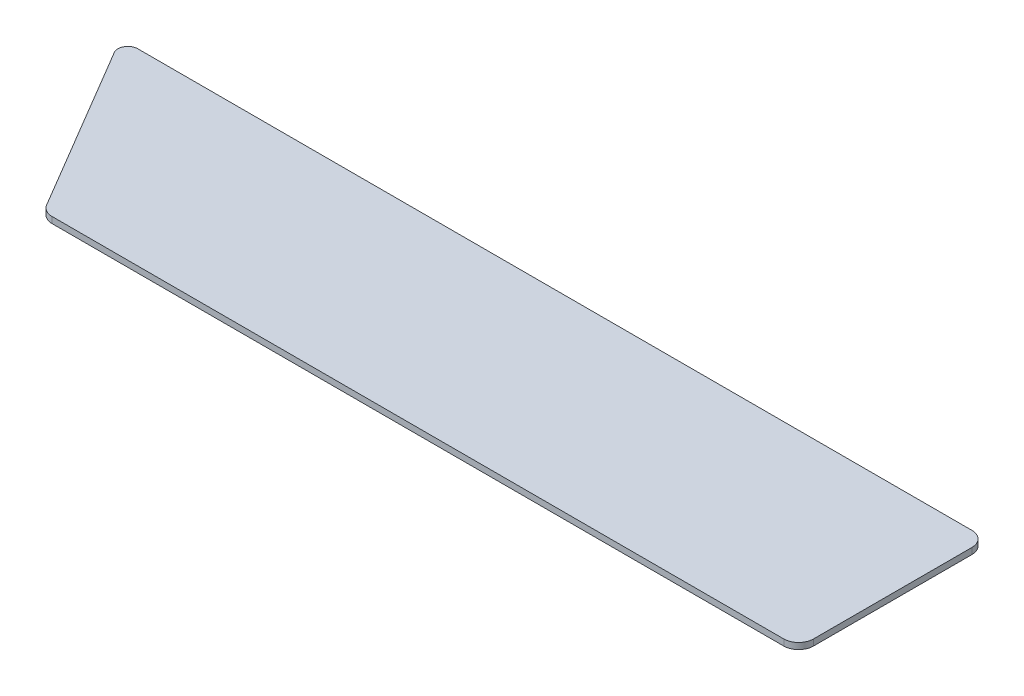
ISO-10303-21;
HEADER;
FILE_DESCRIPTION(('STEP AP214'),'2;1');
FILE_NAME('part.step','',(''),(''),'','','');
FILE_SCHEMA(('AUTOMOTIVE_DESIGN { 1 0 10303 214 1 1 1 1 }'));
ENDSEC;
DATA;
#1=APPLICATION_CONTEXT('core data for automotive mechanical design processes');
#2=APPLICATION_PROTOCOL_DEFINITION('international standard','automotive_design',2000,#1);
#3=PRODUCT_CONTEXT('',#1,'mechanical');
#4=PRODUCT('Part','Part','',(#3));
#5=PRODUCT_RELATED_PRODUCT_CATEGORY('part','',(#4));
#6=PRODUCT_DEFINITION_FORMATION('','',#4);
#7=PRODUCT_DEFINITION_CONTEXT('part definition',#1,'design');
#8=PRODUCT_DEFINITION('design','',#6,#7);
#9=PRODUCT_DEFINITION_SHAPE('','',#8);
#10=(LENGTH_UNIT() NAMED_UNIT(*) SI_UNIT(.MILLI.,.METRE.));
#11=(NAMED_UNIT(*) PLANE_ANGLE_UNIT() SI_UNIT($,.RADIAN.));
#12=(NAMED_UNIT(*) SI_UNIT($,.STERADIAN.) SOLID_ANGLE_UNIT());
#13=UNCERTAINTY_MEASURE_WITH_UNIT(LENGTH_MEASURE(1.E-05),#10,'distance_accuracy_value','');
#14=(GEOMETRIC_REPRESENTATION_CONTEXT(3) GLOBAL_UNCERTAINTY_ASSIGNED_CONTEXT((#13)) GLOBAL_UNIT_ASSIGNED_CONTEXT((#10,
#11,#12)) REPRESENTATION_CONTEXT('',''));
#15=CARTESIAN_POINT('',(0.,0.,0.));
#16=DIRECTION('',(0.,0.,1.));
#17=DIRECTION('',(1.,0.,0.));
#18=AXIS2_PLACEMENT_3D('',#15,#16,#17);
#19=CARTESIAN_POINT('',(0.,3.175,0.));
#20=DIRECTION('',(0.,0.,-1.));
#21=DIRECTION('',(-1.,0.,0.));
#22=AXIS2_PLACEMENT_3D('',#19,#20,#21);
#23=PLANE('',#22);
#24=DIRECTION('',(1.,0.,0.));
#25=VECTOR('',#24,1.);
#26=CARTESIAN_POINT('',(0.,0.,0.));
#27=LINE('',#26,#25);
#28=CARTESIAN_POINT('',(61.4937278471919,0.,0.));
#29=VERTEX_POINT('',#28);
#30=CARTESIAN_POINT('',(436.88,0.,0.));
#31=VERTEX_POINT('',#30);
#32=EDGE_CURVE('E194',#29,#31,#27,.T.);
#33=ORIENTED_EDGE('',*,*,#32,.T.);
#34=DIRECTION('',(0.,-1.,0.));
#35=VECTOR('',#34,1.);
#36=CARTESIAN_POINT('',(436.88,3.175,0.));
#37=LINE('',#36,#35);
#38=CARTESIAN_POINT('',(436.88,3.175,0.));
#39=VERTEX_POINT('',#38);
#40=EDGE_CURVE('E158',#31,#39,#37,.F.);
#41=ORIENTED_EDGE('',*,*,#40,.T.);
#42=DIRECTION('',(1.,0.,0.));
#43=VECTOR('',#42,1.);
#44=CARTESIAN_POINT('',(0.,3.175,0.));
#45=LINE('',#44,#43);
#46=CARTESIAN_POINT('',(61.4937278471919,3.175,0.));
#47=VERTEX_POINT('',#46);
#48=EDGE_CURVE('E180',#47,#39,#45,.T.);
#49=ORIENTED_EDGE('',*,*,#48,.F.);
#50=DIRECTION('',(0.,-1.,0.));
#51=VECTOR('',#50,1.);
#52=CARTESIAN_POINT('',(61.4937278471919,3.175,0.));
#53=LINE('',#52,#51);
#54=EDGE_CURVE('E154',#47,#29,#53,.T.);
#55=ORIENTED_EDGE('',*,*,#54,.T.);
#56=EDGE_LOOP('',(#33,#41,#49,#55));
#57=FACE_BOUND('',#56,.T.);
#58=ADVANCED_FACE('F41',(#57),#23,.F.);
#59=CARTESIAN_POINT('',(444.5,3.175,0.));
#60=DIRECTION('',(-1.,0.,0.));
#61=DIRECTION('',(0.,0.,1.));
#62=AXIS2_PLACEMENT_3D('',#59,#60,#61);
#63=PLANE('',#62);
#64=DIRECTION('',(0.,0.,-1.));
#65=VECTOR('',#64,1.);
#66=CARTESIAN_POINT('',(444.5,0.,0.));
#67=LINE('',#66,#65);
#68=CARTESIAN_POINT('',(444.5,0.,-7.62));
#69=VERTEX_POINT('',#68);
#70=CARTESIAN_POINT('',(444.5,0.,-88.9));
#71=VERTEX_POINT('',#70);
#72=EDGE_CURVE('E111',#69,#71,#67,.T.);
#73=ORIENTED_EDGE('',*,*,#72,.T.);
#74=DIRECTION('',(0.,-1.,0.));
#75=VECTOR('',#74,1.);
#76=CARTESIAN_POINT('',(444.5,3.175,-88.9));
#77=LINE('',#76,#75);
#78=CARTESIAN_POINT('',(444.5,3.175,-88.9));
#79=VERTEX_POINT('',#78);
#80=EDGE_CURVE('E119',#71,#79,#77,.F.);
#81=ORIENTED_EDGE('',*,*,#80,.T.);
#82=DIRECTION('',(0.,0.,-1.));
#83=VECTOR('',#82,1.);
#84=CARTESIAN_POINT('',(444.5,3.175,0.));
#85=LINE('',#84,#83);
#86=CARTESIAN_POINT('',(444.5,3.175,-7.62));
#87=VERTEX_POINT('',#86);
#88=EDGE_CURVE('E183',#87,#79,#85,.T.);
#89=ORIENTED_EDGE('',*,*,#88,.F.);
#90=DIRECTION('',(0.,-1.,0.));
#91=VECTOR('',#90,1.);
#92=CARTESIAN_POINT('',(444.5,3.175,-7.62));
#93=LINE('',#92,#91);
#94=EDGE_CURVE('E121',#87,#69,#93,.T.);
#95=ORIENTED_EDGE('',*,*,#94,.T.);
#96=EDGE_LOOP('',(#73,#81,#89,#95));
#97=FACE_BOUND('',#96,.T.);
#98=ADVANCED_FACE('F200',(#97),#63,.F.);
#99=CARTESIAN_POINT('',(0.,3.175,-96.52));
#100=DIRECTION('',(0.,0.,-1.));
#101=DIRECTION('',(-1.,0.,0.));
#102=AXIS2_PLACEMENT_3D('',#99,#100,#101);
#103=PLANE('',#102);
#104=DIRECTION('',(1.,0.,0.));
#105=VECTOR('',#104,1.);
#106=CARTESIAN_POINT('',(0.,0.,-96.52));
#107=LINE('',#106,#105);
#108=CARTESIAN_POINT('',(8.91160803847884,0.,-96.52));
#109=VERTEX_POINT('',#108);
#110=CARTESIAN_POINT('',(436.88,0.,-96.52));
#111=VERTEX_POINT('',#110);
#112=EDGE_CURVE('E102',#109,#111,#107,.T.);
#113=ORIENTED_EDGE('',*,*,#112,.F.);
#114=DIRECTION('',(0.,-1.,0.));
#115=VECTOR('',#114,1.);
#116=CARTESIAN_POINT('',(8.91160803847884,3.175,-96.52));
#117=LINE('',#116,#115);
#118=CARTESIAN_POINT('',(8.91160803847884,3.175,-96.52));
#119=VERTEX_POINT('',#118);
#120=EDGE_CURVE('E50',#109,#119,#117,.F.);
#121=ORIENTED_EDGE('',*,*,#120,.T.);
#122=DIRECTION('',(1.,0.,0.));
#123=VECTOR('',#122,1.);
#124=CARTESIAN_POINT('',(0.,3.175,-96.52));
#125=LINE('',#124,#123);
#126=CARTESIAN_POINT('',(436.88,3.175,-96.52));
#127=VERTEX_POINT('',#126);
#128=EDGE_CURVE('E125',#119,#127,#125,.T.);
#129=ORIENTED_EDGE('',*,*,#128,.T.);
#130=DIRECTION('',(0.,-1.,0.));
#131=VECTOR('',#130,1.);
#132=CARTESIAN_POINT('',(436.88,0.,-96.52));
#133=LINE('',#132,#131);
#134=EDGE_CURVE('E118',#127,#111,#133,.T.);
#135=ORIENTED_EDGE('',*,*,#134,.T.);
#136=EDGE_LOOP('',(#113,#121,#129,#135));
#137=FACE_BOUND('',#136,.T.);
#138=ADVANCED_FACE('F124',(#137),#103,.T.);
#139=CARTESIAN_POINT('',(42.3148827073452,3.175,-25.0548647609281));
#140=DIRECTION('',(0.860475389038901,0.,-0.509492006667771));
#141=DIRECTION('',(-0.509492006667771,0.,-0.860475389038901));
#142=AXIS2_PLACEMENT_3D('',#139,#140,#141);
#143=PLANE('',#142);
#144=DIRECTION('',(0.509492006667771,0.,0.860475389038901));
#145=VECTOR('',#144,1.);
#146=CARTESIAN_POINT('',(42.3148827073452,3.175,-25.0548647609281));
#147=LINE('',#146,#145);
#148=CARTESIAN_POINT('',(4.54039306216122,3.175,-88.8517806061277));
#149=VERTEX_POINT('',#148);
#150=CARTESIAN_POINT('',(54.9369053827155,3.175,-3.73767090919159));
#151=VERTEX_POINT('',#150);
#152=EDGE_CURVE('E129',#149,#151,#147,.T.);
#153=ORIENTED_EDGE('',*,*,#152,.F.);
#154=DIRECTION('',(0.,-1.,0.));
#155=VECTOR('',#154,1.);
#156=CARTESIAN_POINT('',(4.54039306216122,0.,-88.8517806061277));
#157=LINE('',#156,#155);
#158=CARTESIAN_POINT('',(4.54039306216122,0.,-88.8517806061277));
#159=VERTEX_POINT('',#158);
#160=EDGE_CURVE('E165',#149,#159,#157,.T.);
#161=ORIENTED_EDGE('',*,*,#160,.T.);
#162=DIRECTION('',(0.509492006667771,0.,0.860475389038901));
#163=VECTOR('',#162,1.);
#164=CARTESIAN_POINT('',(42.3148827073452,0.,-25.0548647609281));
#165=LINE('',#164,#163);
#166=CARTESIAN_POINT('',(54.9369053827155,0.,-3.73767090919159));
#167=VERTEX_POINT('',#166);
#168=EDGE_CURVE('E110',#159,#167,#165,.T.);
#169=ORIENTED_EDGE('',*,*,#168,.T.);
#170=DIRECTION('',(0.,-1.,0.));
#171=VECTOR('',#170,1.);
#172=CARTESIAN_POINT('',(54.9369053827155,3.175,-3.73767090919159));
#173=LINE('',#172,#171);
#174=EDGE_CURVE('E161',#167,#151,#173,.F.);
#175=ORIENTED_EDGE('',*,*,#174,.T.);
#176=EDGE_LOOP('',(#153,#161,#169,#175));
#177=FACE_BOUND('',#176,.T.);
#178=ADVANCED_FACE('F174',(#177),#143,.F.);
#179=CARTESIAN_POINT('',(0.,3.175,0.));
#180=DIRECTION('',(0.,1.,0.));
#181=DIRECTION('',(0.,0.,1.));
#182=AXIS2_PLACEMENT_3D('',#179,#180,#181);
#183=PLANE('',#182);
#184=ORIENTED_EDGE('',*,*,#128,.F.);
#185=CARTESIAN_POINT('',(8.91160803847884,3.175,-91.44));
#186=DIRECTION('',(0.,1.,0.));
#187=DIRECTION('',(0.,0.,1.));
#188=AXIS2_PLACEMENT_3D('',#185,#186,#187);
#189=CIRCLE('',#188,5.08);
#190=EDGE_CURVE('E11',#119,#149,#189,.T.);
#191=ORIENTED_EDGE('',*,*,#190,.T.);
#192=ORIENTED_EDGE('',*,*,#152,.T.);
#193=CARTESIAN_POINT('',(61.4937278471919,3.175,-7.62));
#194=DIRECTION('',(0.,1.,0.));
#195=DIRECTION('',(0.,0.,1.));
#196=AXIS2_PLACEMENT_3D('',#193,#194,#195);
#197=CIRCLE('',#196,7.62);
#198=EDGE_CURVE('E145',#151,#47,#197,.T.);
#199=ORIENTED_EDGE('',*,*,#198,.T.);
#200=ORIENTED_EDGE('',*,*,#48,.T.);
#201=CARTESIAN_POINT('',(436.88,3.175,-7.62));
#202=DIRECTION('',(0.,1.,0.));
#203=DIRECTION('',(0.,0.,1.));
#204=AXIS2_PLACEMENT_3D('',#201,#202,#203);
#205=CIRCLE('',#204,7.62);
#206=EDGE_CURVE('E148',#39,#87,#205,.T.);
#207=ORIENTED_EDGE('',*,*,#206,.T.);
#208=ORIENTED_EDGE('',*,*,#88,.T.);
#209=CARTESIAN_POINT('',(436.88,3.175,-88.9));
#210=DIRECTION('',(0.,1.,0.));
#211=DIRECTION('',(0.,0.,1.));
#212=AXIS2_PLACEMENT_3D('',#209,#210,#211);
#213=CIRCLE('',#212,7.62);
#214=EDGE_CURVE('E151',#79,#127,#213,.T.);
#215=ORIENTED_EDGE('',*,*,#214,.T.);
#216=EDGE_LOOP('',(#184,#191,#192,#199,#200,#207,#208,#215));
#217=FACE_BOUND('',#216,.T.);
#218=ADVANCED_FACE('F208',(#217),#183,.T.);
#219=CARTESIAN_POINT('',(0.,0.,0.));
#220=DIRECTION('',(0.,1.,0.));
#221=DIRECTION('',(0.,0.,1.));
#222=AXIS2_PLACEMENT_3D('',#219,#220,#221);
#223=PLANE('',#222);
#224=ORIENTED_EDGE('',*,*,#168,.F.);
#225=CARTESIAN_POINT('',(8.91160803847884,0.,-91.44));
#226=DIRECTION('',(0.,1.,0.));
#227=DIRECTION('',(0.,0.,1.));
#228=AXIS2_PLACEMENT_3D('',#225,#226,#227);
#229=CIRCLE('',#228,5.08);
#230=EDGE_CURVE('E64',#159,#109,#229,.F.);
#231=ORIENTED_EDGE('',*,*,#230,.T.);
#232=ORIENTED_EDGE('',*,*,#112,.T.);
#233=CARTESIAN_POINT('',(436.88,0.,-88.9));
#234=DIRECTION('',(0.,1.,0.));
#235=DIRECTION('',(0.,0.,1.));
#236=AXIS2_PLACEMENT_3D('',#233,#234,#235);
#237=CIRCLE('',#236,7.62);
#238=EDGE_CURVE('E106',#111,#71,#237,.F.);
#239=ORIENTED_EDGE('',*,*,#238,.T.);
#240=ORIENTED_EDGE('',*,*,#72,.F.);
#241=CARTESIAN_POINT('',(436.88,0.,-7.62));
#242=DIRECTION('',(0.,1.,0.));
#243=DIRECTION('',(0.,0.,1.));
#244=AXIS2_PLACEMENT_3D('',#241,#242,#243);
#245=CIRCLE('',#244,7.62);
#246=EDGE_CURVE('E122',#69,#31,#245,.F.);
#247=ORIENTED_EDGE('',*,*,#246,.T.);
#248=ORIENTED_EDGE('',*,*,#32,.F.);
#249=CARTESIAN_POINT('',(61.4937278471919,0.,-7.62));
#250=DIRECTION('',(0.,1.,0.));
#251=DIRECTION('',(0.,0.,1.));
#252=AXIS2_PLACEMENT_3D('',#249,#250,#251);
#253=CIRCLE('',#252,7.62);
#254=EDGE_CURVE('E128',#29,#167,#253,.F.);
#255=ORIENTED_EDGE('',*,*,#254,.T.);
#256=EDGE_LOOP('',(#224,#231,#232,#239,#240,#247,#248,#255));
#257=FACE_BOUND('',#256,.T.);
#258=ADVANCED_FACE('F104',(#257),#223,.F.);
#259=CARTESIAN_POINT('',(436.88,3.175,-88.9));
#260=DIRECTION('',(0.,1.,0.));
#261=DIRECTION('',(0.,0.,1.));
#262=AXIS2_PLACEMENT_3D('',#259,#260,#261);
#263=CYLINDRICAL_SURFACE('',#262,7.62);
#264=ORIENTED_EDGE('',*,*,#214,.F.);
#265=ORIENTED_EDGE('',*,*,#80,.F.);
#266=ORIENTED_EDGE('',*,*,#238,.F.);
#267=ORIENTED_EDGE('',*,*,#134,.F.);
#268=EDGE_LOOP('',(#264,#265,#266,#267));
#269=FACE_BOUND('',#268,.T.);
#270=ADVANCED_FACE('F117',(#269),#263,.T.);
#271=CARTESIAN_POINT('',(436.88,3.175,-7.62));
#272=DIRECTION('',(0.,-1.,0.));
#273=DIRECTION('',(0.,0.,-1.));
#274=AXIS2_PLACEMENT_3D('',#271,#272,#273);
#275=CYLINDRICAL_SURFACE('',#274,7.62);
#276=ORIENTED_EDGE('',*,*,#206,.F.);
#277=ORIENTED_EDGE('',*,*,#40,.F.);
#278=ORIENTED_EDGE('',*,*,#246,.F.);
#279=ORIENTED_EDGE('',*,*,#94,.F.);
#280=EDGE_LOOP('',(#276,#277,#278,#279));
#281=FACE_BOUND('',#280,.T.);
#282=ADVANCED_FACE('F207',(#281),#275,.T.);
#283=CARTESIAN_POINT('',(61.4937278471919,3.175,-7.62));
#284=DIRECTION('',(0.,-1.,0.));
#285=DIRECTION('',(0.,0.,-1.));
#286=AXIS2_PLACEMENT_3D('',#283,#284,#285);
#287=CYLINDRICAL_SURFACE('',#286,7.62);
#288=ORIENTED_EDGE('',*,*,#198,.F.);
#289=ORIENTED_EDGE('',*,*,#174,.F.);
#290=ORIENTED_EDGE('',*,*,#254,.F.);
#291=ORIENTED_EDGE('',*,*,#54,.F.);
#292=EDGE_LOOP('',(#288,#289,#290,#291));
#293=FACE_BOUND('',#292,.T.);
#294=ADVANCED_FACE('F210',(#293),#287,.T.);
#295=CARTESIAN_POINT('',(8.91160803847884,3.175,-91.44));
#296=DIRECTION('',(0.,1.,0.));
#297=DIRECTION('',(0.,0.,1.));
#298=AXIS2_PLACEMENT_3D('',#295,#296,#297);
#299=CYLINDRICAL_SURFACE('',#298,5.08);
#300=ORIENTED_EDGE('',*,*,#190,.F.);
#301=ORIENTED_EDGE('',*,*,#120,.F.);
#302=ORIENTED_EDGE('',*,*,#230,.F.);
#303=ORIENTED_EDGE('',*,*,#160,.F.);
#304=EDGE_LOOP('',(#300,#301,#302,#303));
#305=FACE_BOUND('',#304,.T.);
#306=ADVANCED_FACE('F43',(#305),#299,.T.);
#307=CLOSED_SHELL('',(#58,#98,#138,#178,#218,#258,#270,#282,#294,#306));
#308=MANIFOLD_SOLID_BREP('B2',#307);
#309=ADVANCED_BREP_SHAPE_REPRESENTATION('',(#18,#308),#14);
#310=SHAPE_DEFINITION_REPRESENTATION(#9,#309);
ENDSEC;
END-ISO-10303-21;
